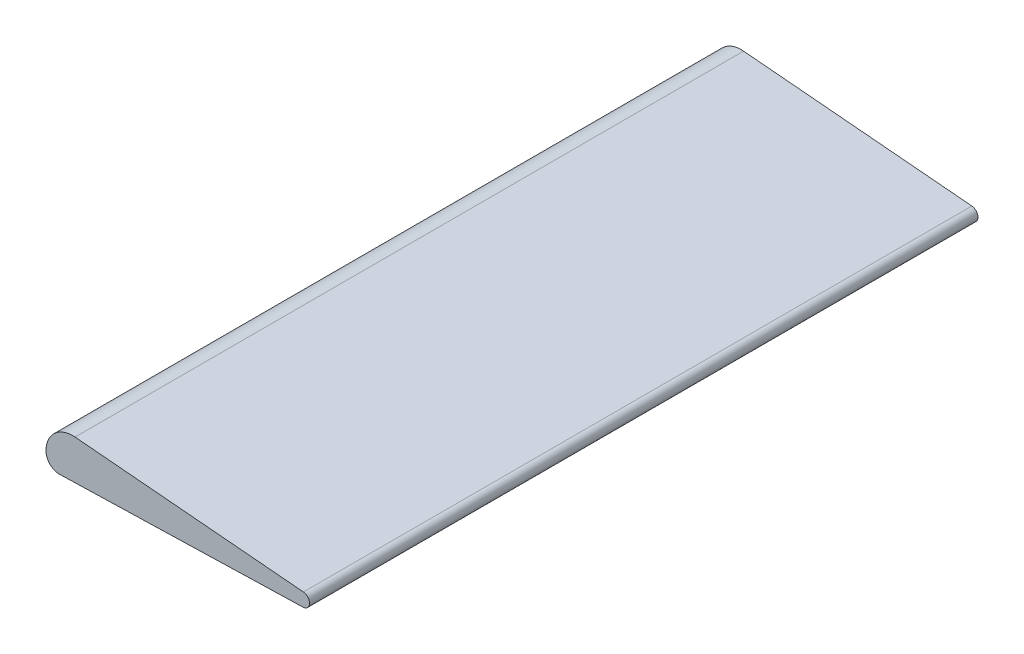
ISO-10303-21;
HEADER;
FILE_DESCRIPTION(('STEP AP214'),'2;1');
FILE_NAME('part.step','',(''),(''),'','','');
FILE_SCHEMA(('AUTOMOTIVE_DESIGN { 1 0 10303 214 1 1 1 1 }'));
ENDSEC;
DATA;
#1=APPLICATION_CONTEXT('core data for automotive mechanical design processes');
#2=APPLICATION_PROTOCOL_DEFINITION('international standard','automotive_design',2000,#1);
#3=PRODUCT_CONTEXT('',#1,'mechanical');
#4=PRODUCT('Part','Part','',(#3));
#5=PRODUCT_RELATED_PRODUCT_CATEGORY('part','',(#4));
#6=PRODUCT_DEFINITION_FORMATION('','',#4);
#7=PRODUCT_DEFINITION_CONTEXT('part definition',#1,'design');
#8=PRODUCT_DEFINITION('design','',#6,#7);
#9=PRODUCT_DEFINITION_SHAPE('','',#8);
#10=(LENGTH_UNIT() NAMED_UNIT(*) SI_UNIT(.MILLI.,.METRE.));
#11=(NAMED_UNIT(*) PLANE_ANGLE_UNIT() SI_UNIT($,.RADIAN.));
#12=(NAMED_UNIT(*) SI_UNIT($,.STERADIAN.) SOLID_ANGLE_UNIT());
#13=UNCERTAINTY_MEASURE_WITH_UNIT(LENGTH_MEASURE(1.E-05),#10,'distance_accuracy_value','');
#14=(GEOMETRIC_REPRESENTATION_CONTEXT(3) GLOBAL_UNCERTAINTY_ASSIGNED_CONTEXT((#13)) GLOBAL_UNIT_ASSIGNED_CONTEXT((#10,
#11,#12)) REPRESENTATION_CONTEXT('',''));
#15=CARTESIAN_POINT('',(0.,0.,0.));
#16=DIRECTION('',(0.,0.,1.));
#17=DIRECTION('',(1.,0.,0.));
#18=AXIS2_PLACEMENT_3D('',#15,#16,#17);
#19=CARTESIAN_POINT('',(0.508,0.,12.7));
#20=DIRECTION('',(0.,0.,-1.));
#21=DIRECTION('',(-1.,0.,0.));
#22=AXIS2_PLACEMENT_3D('',#19,#20,#21);
#23=CYLINDRICAL_SURFACE('',#22,0.508);
#24=CARTESIAN_POINT('',(0.508,0.,-12.7));
#25=DIRECTION('',(0.,0.,1.));
#26=DIRECTION('',(1.,0.,0.));
#27=AXIS2_PLACEMENT_3D('',#24,#25,#26);
#28=CIRCLE('',#27,0.508);
#29=CARTESIAN_POINT('',(0.,0.,-12.7));
#30=VERTEX_POINT('',#29);
#31=CARTESIAN_POINT('',(0.521947943520389,-0.507808482473021,-12.7));
#32=VERTEX_POINT('',#31);
#33=EDGE_CURVE('E118',#30,#32,#28,.T.);
#34=ORIENTED_EDGE('',*,*,#33,.T.);
#35=DIRECTION('',(0.,0.,-1.));
#36=VECTOR('',#35,1.);
#37=CARTESIAN_POINT('',(0.521947943520389,-0.507808482473021,12.7));
#38=LINE('',#37,#36);
#39=CARTESIAN_POINT('',(0.521947943520389,-0.507808482473021,12.7));
#40=VERTEX_POINT('',#39);
#41=EDGE_CURVE('E11',#40,#32,#38,.T.);
#42=ORIENTED_EDGE('',*,*,#41,.F.);
#43=CARTESIAN_POINT('',(0.508,0.,12.7));
#44=DIRECTION('',(0.,0.,1.));
#45=DIRECTION('',(1.,0.,0.));
#46=AXIS2_PLACEMENT_3D('',#43,#44,#45);
#47=CIRCLE('',#46,0.508);
#48=CARTESIAN_POINT('',(0.,0.,12.7));
#49=VERTEX_POINT('',#48);
#50=EDGE_CURVE('E131',#49,#40,#47,.T.);
#51=ORIENTED_EDGE('',*,*,#50,.F.);
#52=DIRECTION('',(0.,0.,-1.));
#53=VECTOR('',#52,1.);
#54=CARTESIAN_POINT('',(0.,0.,12.7));
#55=LINE('',#54,#53);
#56=EDGE_CURVE('E114',#49,#30,#55,.T.);
#57=ORIENTED_EDGE('',*,*,#56,.T.);
#58=EDGE_LOOP('',(#34,#42,#51,#57));
#59=FACE_BOUND('',#58,.T.);
#60=ADVANCED_FACE('F39',(#59),#23,.T.);
#61=CARTESIAN_POINT('',(0.521947943520389,-0.507808482473021,12.7));
#62=DIRECTION('',(-0.027456581733049,0.999622996994135,0.));
#63=DIRECTION('',(-0.999622996994135,-0.027456581733049,0.));
#64=AXIS2_PLACEMENT_3D('',#61,#62,#63);
#65=PLANE('',#64);
#66=DIRECTION('',(0.999622996994135,0.027456581733049,0.));
#67=VECTOR('',#66,1.);
#68=CARTESIAN_POINT('',(0.521947943520389,-0.507808482473021,-12.7));
#69=LINE('',#68,#67);
#70=CARTESIAN_POINT('',(9.76594346496061,-0.25390424123651,-12.7));
#71=VERTEX_POINT('',#70);
#72=EDGE_CURVE('E122',#32,#71,#69,.T.);
#73=ORIENTED_EDGE('',*,*,#72,.T.);
#74=DIRECTION('',(0.,0.,-1.));
#75=VECTOR('',#74,1.);
#76=CARTESIAN_POINT('',(9.76594346496061,-0.25390424123651,12.7));
#77=LINE('',#76,#75);
#78=CARTESIAN_POINT('',(9.76594346496061,-0.25390424123651,12.7));
#79=VERTEX_POINT('',#78);
#80=EDGE_CURVE('E48',#79,#71,#77,.T.);
#81=ORIENTED_EDGE('',*,*,#80,.F.);
#82=DIRECTION('',(0.999622996994135,0.027456581733049,0.));
#83=VECTOR('',#82,1.);
#84=CARTESIAN_POINT('',(0.521947943520389,-0.507808482473021,12.7));
#85=LINE('',#84,#83);
#86=EDGE_CURVE('E90',#40,#79,#85,.T.);
#87=ORIENTED_EDGE('',*,*,#86,.F.);
#88=ORIENTED_EDGE('',*,*,#41,.T.);
#89=EDGE_LOOP('',(#73,#81,#87,#88));
#90=FACE_BOUND('',#89,.T.);
#91=ADVANCED_FACE('F153',(#90),#65,.F.);
#92=CARTESIAN_POINT('',(9.75896949320041,0.,12.7));
#93=DIRECTION('',(0.,0.,-1.));
#94=DIRECTION('',(-1.,0.,0.));
#95=AXIS2_PLACEMENT_3D('',#92,#93,#94);
#96=CYLINDRICAL_SURFACE('',#95,0.254);
#97=CARTESIAN_POINT('',(9.75896949320041,0.,-12.7));
#98=DIRECTION('',(0.,0.,1.));
#99=DIRECTION('',(1.,0.,0.));
#100=AXIS2_PLACEMENT_3D('',#97,#98,#99);
#101=CIRCLE('',#100,0.254);
#102=CARTESIAN_POINT('',(9.78110705185832,0.253033453315303,-12.7));
#103=VERTEX_POINT('',#102);
#104=EDGE_CURVE('E106',#71,#103,#101,.T.);
#105=ORIENTED_EDGE('',*,*,#104,.T.);
#106=DIRECTION('',(0.,0.,-1.));
#107=VECTOR('',#106,1.);
#108=CARTESIAN_POINT('',(9.78110705185832,0.253033453315303,12.7));
#109=LINE('',#108,#107);
#110=CARTESIAN_POINT('',(9.78110705185832,0.253033453315303,12.7));
#111=VERTEX_POINT('',#110);
#112=EDGE_CURVE('E103',#111,#103,#109,.T.);
#113=ORIENTED_EDGE('',*,*,#112,.F.);
#114=CARTESIAN_POINT('',(9.75896949320041,0.,12.7));
#115=DIRECTION('',(0.,0.,1.));
#116=DIRECTION('',(1.,0.,0.));
#117=AXIS2_PLACEMENT_3D('',#114,#115,#116);
#118=CIRCLE('',#117,0.254);
#119=EDGE_CURVE('E94',#79,#111,#118,.T.);
#120=ORIENTED_EDGE('',*,*,#119,.F.);
#121=ORIENTED_EDGE('',*,*,#80,.T.);
#122=EDGE_LOOP('',(#105,#113,#120,#121));
#123=FACE_BOUND('',#122,.T.);
#124=ADVANCED_FACE('F104',(#123),#96,.T.);
#125=CARTESIAN_POINT('',(1.10455023463162,1.01213381326121,12.7));
#126=DIRECTION('',(-0.0871557427476584,-0.996194698091746,0.));
#127=DIRECTION('',(0.996194698091746,-0.0871557427476584,0.));
#128=AXIS2_PLACEMENT_3D('',#125,#126,#127);
#129=PLANE('',#128);
#130=DIRECTION('',(-0.996194698091746,0.0871557427476584,0.));
#131=VECTOR('',#130,1.);
#132=CARTESIAN_POINT('',(1.10455023463162,1.01213381326121,-12.7));
#133=LINE('',#132,#131);
#134=CARTESIAN_POINT('',(1.10455023463162,1.01213381326121,-12.7));
#135=VERTEX_POINT('',#134);
#136=EDGE_CURVE('E76',#103,#135,#133,.T.);
#137=ORIENTED_EDGE('',*,*,#136,.T.);
#138=DIRECTION('',(0.,0.,-1.));
#139=VECTOR('',#138,1.);
#140=CARTESIAN_POINT('',(1.10455023463162,1.01213381326121,12.7));
#141=LINE('',#140,#139);
#142=CARTESIAN_POINT('',(1.10455023463162,1.01213381326121,12.7));
#143=VERTEX_POINT('',#142);
#144=EDGE_CURVE('E108',#143,#135,#141,.T.);
#145=ORIENTED_EDGE('',*,*,#144,.F.);
#146=DIRECTION('',(-0.996194698091746,0.0871557427476584,0.));
#147=VECTOR('',#146,1.);
#148=CARTESIAN_POINT('',(1.10455023463162,1.01213381326121,12.7));
#149=LINE('',#148,#147);
#150=EDGE_CURVE('E98',#111,#143,#149,.T.);
#151=ORIENTED_EDGE('',*,*,#150,.F.);
#152=ORIENTED_EDGE('',*,*,#112,.T.);
#153=EDGE_LOOP('',(#137,#145,#151,#152));
#154=FACE_BOUND('',#153,.T.);
#155=ADVANCED_FACE('F110',(#154),#129,.F.);
#156=CARTESIAN_POINT('',(1.016,0.,12.7));
#157=DIRECTION('',(0.,0.,-1.));
#158=DIRECTION('',(-1.,0.,0.));
#159=AXIS2_PLACEMENT_3D('',#156,#157,#158);
#160=CYLINDRICAL_SURFACE('',#159,1.016);
#161=CARTESIAN_POINT('',(1.016,0.,-12.7));
#162=DIRECTION('',(0.,0.,1.));
#163=DIRECTION('',(1.,0.,0.));
#164=AXIS2_PLACEMENT_3D('',#161,#162,#163);
#165=CIRCLE('',#164,1.016);
#166=EDGE_CURVE('E82',#135,#30,#165,.T.);
#167=ORIENTED_EDGE('',*,*,#166,.T.);
#168=ORIENTED_EDGE('',*,*,#56,.F.);
#169=CARTESIAN_POINT('',(1.016,0.,12.7));
#170=DIRECTION('',(0.,0.,1.));
#171=DIRECTION('',(1.,0.,0.));
#172=AXIS2_PLACEMENT_3D('',#169,#170,#171);
#173=CIRCLE('',#172,1.016);
#174=EDGE_CURVE('E56',#143,#49,#173,.T.);
#175=ORIENTED_EDGE('',*,*,#174,.F.);
#176=ORIENTED_EDGE('',*,*,#144,.T.);
#177=EDGE_LOOP('',(#167,#168,#175,#176));
#178=FACE_BOUND('',#177,.T.);
#179=ADVANCED_FACE('F142',(#178),#160,.T.);
#180=CARTESIAN_POINT('',(0.508,0.,12.7));
#181=DIRECTION('',(0.,0.,1.));
#182=DIRECTION('',(1.,0.,0.));
#183=AXIS2_PLACEMENT_3D('',#180,#181,#182);
#184=PLANE('',#183);
#185=ORIENTED_EDGE('',*,*,#50,.T.);
#186=ORIENTED_EDGE('',*,*,#86,.T.);
#187=ORIENTED_EDGE('',*,*,#119,.T.);
#188=ORIENTED_EDGE('',*,*,#150,.T.);
#189=ORIENTED_EDGE('',*,*,#174,.T.);
#190=EDGE_LOOP('',(#185,#186,#187,#188,#189));
#191=FACE_BOUND('',#190,.T.);
#192=ADVANCED_FACE('F96',(#191),#184,.T.);
#193=CARTESIAN_POINT('',(0.508,0.,-12.7));
#194=DIRECTION('',(0.,0.,1.));
#195=DIRECTION('',(1.,0.,0.));
#196=AXIS2_PLACEMENT_3D('',#193,#194,#195);
#197=PLANE('',#196);
#198=ORIENTED_EDGE('',*,*,#33,.F.);
#199=ORIENTED_EDGE('',*,*,#166,.F.);
#200=ORIENTED_EDGE('',*,*,#136,.F.);
#201=ORIENTED_EDGE('',*,*,#104,.F.);
#202=ORIENTED_EDGE('',*,*,#72,.F.);
#203=EDGE_LOOP('',(#198,#199,#200,#201,#202));
#204=FACE_BOUND('',#203,.T.);
#205=ADVANCED_FACE('F138',(#204),#197,.F.);
#206=CLOSED_SHELL('',(#60,#91,#124,#155,#179,#192,#205));
#207=MANIFOLD_SOLID_BREP('B2',#206);
#208=ADVANCED_BREP_SHAPE_REPRESENTATION('',(#18,#207),#14);
#209=SHAPE_DEFINITION_REPRESENTATION(#9,#208);
ENDSEC;
END-ISO-10303-21;
